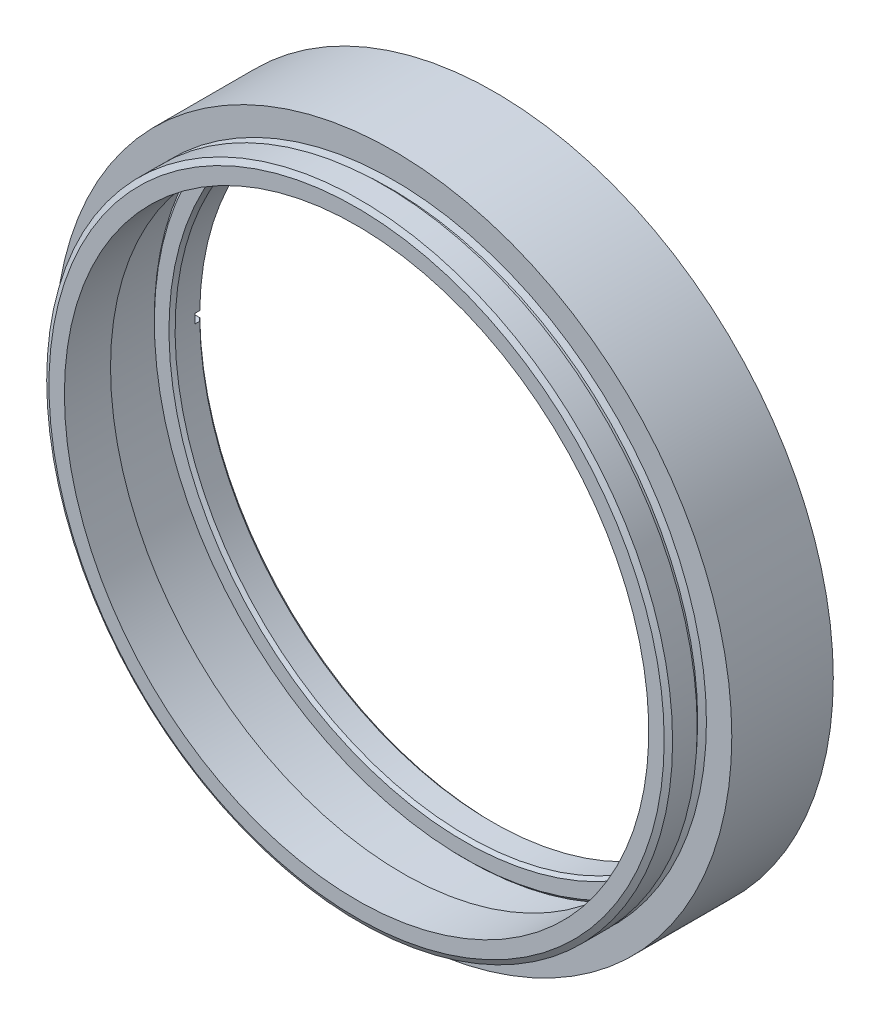
ISO-10303-21;
HEADER;
FILE_DESCRIPTION(('STEP AP214'),'2;1');
FILE_NAME('part.step','',(''),(''),'','','');
FILE_SCHEMA(('AUTOMOTIVE_DESIGN { 1 0 10303 214 1 1 1 1 }'));
ENDSEC;
DATA;
#1=APPLICATION_CONTEXT('core data for automotive mechanical design processes');
#2=APPLICATION_PROTOCOL_DEFINITION('international standard','automotive_design',2000,#1);
#3=PRODUCT_CONTEXT('',#1,'mechanical');
#4=PRODUCT('Part','Part','',(#3));
#5=PRODUCT_RELATED_PRODUCT_CATEGORY('part','',(#4));
#6=PRODUCT_DEFINITION_FORMATION('','',#4);
#7=PRODUCT_DEFINITION_CONTEXT('part definition',#1,'design');
#8=PRODUCT_DEFINITION('design','',#6,#7);
#9=PRODUCT_DEFINITION_SHAPE('','',#8);
#10=(LENGTH_UNIT() NAMED_UNIT(*) SI_UNIT(.MILLI.,.METRE.));
#11=(NAMED_UNIT(*) PLANE_ANGLE_UNIT() SI_UNIT($,.RADIAN.));
#12=(NAMED_UNIT(*) SI_UNIT($,.STERADIAN.) SOLID_ANGLE_UNIT());
#13=UNCERTAINTY_MEASURE_WITH_UNIT(LENGTH_MEASURE(1.E-05),#10,'distance_accuracy_value','');
#14=(GEOMETRIC_REPRESENTATION_CONTEXT(3) GLOBAL_UNCERTAINTY_ASSIGNED_CONTEXT((#13)) GLOBAL_UNIT_ASSIGNED_CONTEXT((#10,
#11,#12)) REPRESENTATION_CONTEXT('',''));
#15=CARTESIAN_POINT('',(0.,0.,0.));
#16=DIRECTION('',(0.,0.,1.));
#17=DIRECTION('',(1.,0.,0.));
#18=AXIS2_PLACEMENT_3D('',#15,#16,#17);
#19=CARTESIAN_POINT('',(0.,0.,5.715));
#20=DIRECTION('',(0.,0.,-1.));
#21=DIRECTION('',(-1.,0.,0.));
#22=AXIS2_PLACEMENT_3D('',#19,#20,#21);
#23=CYLINDRICAL_SURFACE('',#22,24.13);
#24=CARTESIAN_POINT('',(0.,0.,5.715));
#25=DIRECTION('',(0.,0.,-1.));
#26=DIRECTION('',(-1.,0.,0.));
#27=AXIS2_PLACEMENT_3D('',#24,#25,#26);
#28=CIRCLE('',#27,24.13);
#29=CARTESIAN_POINT('',(-24.13,0.,5.715));
#30=VERTEX_POINT('',#29);
#31=EDGE_CURVE('P0_E37',#30,#30,#28,.T.);
#32=ORIENTED_EDGE('',*,*,#31,.F.);
#33=EDGE_LOOP('',(#32));
#34=FACE_BOUND('',#33,.T.);
#35=CARTESIAN_POINT('',(0.,0.,1.905));
#36=DIRECTION('',(0.,0.,-1.));
#37=DIRECTION('',(-1.,0.,0.));
#38=AXIS2_PLACEMENT_3D('',#35,#36,#37);
#39=CIRCLE('',#38,24.13);
#40=CARTESIAN_POINT('',(-24.13,0.,1.905));
#41=VERTEX_POINT('',#40);
#42=EDGE_CURVE('P0_E34',#41,#41,#39,.F.);
#43=ORIENTED_EDGE('',*,*,#42,.F.);
#44=EDGE_LOOP('',(#43));
#45=FACE_BOUND('',#44,.T.);
#46=ADVANCED_FACE('P0_F13',(#34,#45),#23,.F.);
#47=CARTESIAN_POINT('',(0.,0.,-5.715));
#48=DIRECTION('',(0.,0.,-1.));
#49=DIRECTION('',(-1.,0.,0.));
#50=AXIS2_PLACEMENT_3D('',#47,#48,#49);
#51=PLANE('',#50);
#52=CARTESIAN_POINT('',(0.,0.,-5.715));
#53=DIRECTION('',(0.,0.,-1.));
#54=DIRECTION('',(-1.,0.,0.));
#55=AXIS2_PLACEMENT_3D('',#52,#53,#54);
#56=CIRCLE('',#55,26.0985000000001);
#57=CARTESIAN_POINT('',(-26.0985000000001,0.,-5.715));
#58=VERTEX_POINT('',#57);
#59=EDGE_CURVE('P0_E9',#58,#58,#56,.F.);
#60=ORIENTED_EDGE('',*,*,#59,.T.);
#61=EDGE_LOOP('',(#60));
#62=FACE_BOUND('',#61,.T.);
#63=CARTESIAN_POINT('',(0.,0.,-5.71500000000001));
#64=DIRECTION('',(0.,0.,1.));
#65=DIRECTION('',(1.,0.,0.));
#66=AXIS2_PLACEMENT_3D('',#63,#64,#65);
#67=CIRCLE('',#66,27.94);
#68=CARTESIAN_POINT('',(27.94,0.,-5.71500000000001));
#69=VERTEX_POINT('',#68);
#70=EDGE_CURVE('P0_E52',#69,#69,#67,.T.);
#71=ORIENTED_EDGE('',*,*,#70,.F.);
#72=EDGE_LOOP('',(#71));
#73=FACE_BOUND('',#72,.T.);
#74=ADVANCED_FACE('P0_F86',(#62,#73),#51,.T.);
#75=CARTESIAN_POINT('',(0.,0.,5.715));
#76=DIRECTION('',(0.,0.,1.));
#77=DIRECTION('',(1.,0.,0.));
#78=AXIS2_PLACEMENT_3D('',#75,#76,#77);
#79=PLANE('',#78);
#80=CARTESIAN_POINT('',(0.,0.,5.715));
#81=DIRECTION('',(0.,0.,1.));
#82=DIRECTION('',(1.,0.,0.));
#83=AXIS2_PLACEMENT_3D('',#80,#81,#82);
#84=CIRCLE('',#83,25.4045590948775);
#85=CARTESIAN_POINT('',(25.4045590948775,0.,5.715));
#86=VERTEX_POINT('',#85);
#87=EDGE_CURVE('P0_E30',#86,#86,#84,.T.);
#88=ORIENTED_EDGE('',*,*,#87,.T.);
#89=EDGE_LOOP('',(#88));
#90=FACE_BOUND('',#89,.T.);
#91=ORIENTED_EDGE('',*,*,#31,.T.);
#92=EDGE_LOOP('',(#91));
#93=FACE_BOUND('',#92,.T.);
#94=ADVANCED_FACE('P0_F92',(#90,#93),#79,.T.);
#95=CARTESIAN_POINT('',(0.,0.,17.8527412539212));
#96=DIRECTION('',(0.,0.,1.));
#97=DIRECTION('',(1.,0.,0.));
#98=AXIS2_PLACEMENT_3D('',#95,#96,#97);
#99=CYLINDRICAL_SURFACE('',#98,25.8445);
#100=CARTESIAN_POINT('',(0.,0.,5.46100000000001));
#101=DIRECTION('',(0.,0.,1.));
#102=DIRECTION('',(1.,0.,0.));
#103=AXIS2_PLACEMENT_3D('',#100,#101,#102);
#104=CIRCLE('',#103,25.8445);
#105=CARTESIAN_POINT('',(25.8445,0.,5.46100000000001));
#106=VERTEX_POINT('',#105);
#107=EDGE_CURVE('P0_E25',#106,#106,#104,.F.);
#108=ORIENTED_EDGE('',*,*,#107,.T.);
#109=EDGE_LOOP('',(#108));
#110=FACE_BOUND('',#109,.T.);
#111=CARTESIAN_POINT('',(0.,0.,3.42899999999998));
#112=DIRECTION('',(0.,0.,1.));
#113=DIRECTION('',(1.,0.,0.));
#114=AXIS2_PLACEMENT_3D('',#111,#112,#113);
#115=CIRCLE('',#114,25.8445);
#116=CARTESIAN_POINT('',(25.8445,0.,3.42899999999998));
#117=VERTEX_POINT('',#116);
#118=EDGE_CURVE('P0_E33',#117,#117,#115,.T.);
#119=ORIENTED_EDGE('',*,*,#118,.T.);
#120=EDGE_LOOP('',(#119));
#121=FACE_BOUND('',#120,.T.);
#122=ADVANCED_FACE('P0_F119',(#110,#121),#99,.T.);
#123=CARTESIAN_POINT('',(0.,0.,3.42899999999998));
#124=DIRECTION('',(0.,0.,1.));
#125=DIRECTION('',(1.,0.,0.));
#126=AXIS2_PLACEMENT_3D('',#123,#124,#125);
#127=CONICAL_SURFACE('',#126,25.8445,1.04719755119667);
#128=CARTESIAN_POINT('',(0.,0.,3.16503545692652));
#129=DIRECTION('',(0.,0.,1.));
#130=DIRECTION('',(1.,0.,0.));
#131=AXIS2_PLACEMENT_3D('',#128,#129,#130);
#132=CIRCLE('',#131,25.3873);
#133=CARTESIAN_POINT('',(25.3873,0.,3.16503545692652));
#134=VERTEX_POINT('',#133);
#135=EDGE_CURVE('P0_E40',#134,#134,#132,.T.);
#136=ORIENTED_EDGE('',*,*,#135,.T.);
#137=EDGE_LOOP('',(#136));
#138=FACE_BOUND('',#137,.T.);
#139=ORIENTED_EDGE('',*,*,#118,.F.);
#140=EDGE_LOOP('',(#139));
#141=FACE_BOUND('',#140,.T.);
#142=ADVANCED_FACE('P0_F115',(#138,#141),#127,.T.);
#143=CARTESIAN_POINT('',(0.,0.,17.8527412539212));
#144=DIRECTION('',(0.,0.,1.));
#145=DIRECTION('',(1.,0.,0.));
#146=AXIS2_PLACEMENT_3D('',#143,#144,#145);
#147=CYLINDRICAL_SURFACE('',#146,25.3873);
#148=CARTESIAN_POINT('',(0.,0.,2.9309645430735));
#149=DIRECTION('',(0.,0.,1.));
#150=DIRECTION('',(1.,0.,0.));
#151=AXIS2_PLACEMENT_3D('',#148,#149,#150);
#152=CIRCLE('',#151,25.3873);
#153=CARTESIAN_POINT('',(25.3873,0.,2.9309645430735));
#154=VERTEX_POINT('',#153);
#155=EDGE_CURVE('P0_E43',#154,#154,#152,.T.);
#156=ORIENTED_EDGE('',*,*,#155,.T.);
#157=EDGE_LOOP('',(#156));
#158=FACE_BOUND('',#157,.T.);
#159=ORIENTED_EDGE('',*,*,#135,.F.);
#160=EDGE_LOOP('',(#159));
#161=FACE_BOUND('',#160,.T.);
#162=ADVANCED_FACE('P0_F111',(#158,#161),#147,.T.);
#163=CARTESIAN_POINT('',(0.,0.,2.9309645430735));
#164=DIRECTION('',(0.,0.,-1.));
#165=DIRECTION('',(-1.,0.,0.));
#166=AXIS2_PLACEMENT_3D('',#163,#164,#165);
#167=CONICAL_SURFACE('',#166,25.3873,1.0471975511966);
#168=CARTESIAN_POINT('',(0.,0.,2.667));
#169=DIRECTION('',(0.,0.,1.));
#170=DIRECTION('',(1.,0.,0.));
#171=AXIS2_PLACEMENT_3D('',#168,#169,#170);
#172=CIRCLE('',#171,25.8445);
#173=CARTESIAN_POINT('',(25.8445,0.,2.667));
#174=VERTEX_POINT('',#173);
#175=EDGE_CURVE('P0_E46',#174,#174,#172,.T.);
#176=ORIENTED_EDGE('',*,*,#175,.T.);
#177=EDGE_LOOP('',(#176));
#178=FACE_BOUND('',#177,.T.);
#179=ORIENTED_EDGE('',*,*,#155,.F.);
#180=EDGE_LOOP('',(#179));
#181=FACE_BOUND('',#180,.T.);
#182=ADVANCED_FACE('P0_F107',(#178,#181),#167,.T.);
#183=CARTESIAN_POINT('',(0.,-25.8445,2.667));
#184=DIRECTION('',(0.,0.,1.));
#185=DIRECTION('',(1.,0.,0.));
#186=AXIS2_PLACEMENT_3D('',#183,#184,#185);
#187=PLANE('',#186);
#188=CARTESIAN_POINT('',(0.,0.,2.66699999999999));
#189=DIRECTION('',(0.,0.,1.));
#190=DIRECTION('',(1.,0.,0.));
#191=AXIS2_PLACEMENT_3D('',#188,#189,#190);
#192=CIRCLE('',#191,27.94);
#193=CARTESIAN_POINT('',(27.94,0.,2.66699999999999));
#194=VERTEX_POINT('',#193);
#195=EDGE_CURVE('P0_E49',#194,#194,#192,.T.);
#196=ORIENTED_EDGE('',*,*,#195,.T.);
#197=EDGE_LOOP('',(#196));
#198=FACE_BOUND('',#197,.T.);
#199=ORIENTED_EDGE('',*,*,#175,.F.);
#200=EDGE_LOOP('',(#199));
#201=FACE_BOUND('',#200,.T.);
#202=ADVANCED_FACE('P0_F103',(#198,#201),#187,.T.);
#203=CARTESIAN_POINT('',(0.,0.,17.8527412539212));
#204=DIRECTION('',(0.,0.,1.));
#205=DIRECTION('',(1.,0.,0.));
#206=AXIS2_PLACEMENT_3D('',#203,#204,#205);
#207=CYLINDRICAL_SURFACE('',#206,27.94);
#208=ORIENTED_EDGE('',*,*,#70,.T.);
#209=EDGE_LOOP('',(#208));
#210=FACE_BOUND('',#209,.T.);
#211=ORIENTED_EDGE('',*,*,#195,.F.);
#212=EDGE_LOOP('',(#211));
#213=FACE_BOUND('',#212,.T.);
#214=ADVANCED_FACE('P0_F99',(#210,#213),#207,.T.);
#215=CARTESIAN_POINT('',(0.,0.,1.905));
#216=DIRECTION('',(0.,0.,-1.));
#217=DIRECTION('',(-1.,0.,0.));
#218=AXIS2_PLACEMENT_3D('',#215,#216,#217);
#219=PLANE('',#218);
#220=ORIENTED_EDGE('',*,*,#42,.T.);
#221=EDGE_LOOP('',(#220));
#222=FACE_BOUND('',#221,.T.);
#223=CARTESIAN_POINT('',(0.,0.,1.905));
#224=DIRECTION('',(0.,0.,-1.));
#225=DIRECTION('',(-1.,0.,0.));
#226=AXIS2_PLACEMENT_3D('',#223,#224,#225);
#227=CIRCLE('',#226,26.0985);
#228=CARTESIAN_POINT('',(-26.0985,0.,1.905));
#229=VERTEX_POINT('',#228);
#230=EDGE_CURVE('P0_E60',#229,#229,#227,.T.);
#231=ORIENTED_EDGE('',*,*,#230,.T.);
#232=EDGE_LOOP('',(#231));
#233=FACE_BOUND('',#232,.T.);
#234=ADVANCED_FACE('P0_F102',(#222,#233),#219,.T.);
#235=CARTESIAN_POINT('',(0.,0.,1.905));
#236=DIRECTION('',(0.,0.,-1.));
#237=DIRECTION('',(-1.,0.,0.));
#238=AXIS2_PLACEMENT_3D('',#235,#236,#237);
#239=CYLINDRICAL_SURFACE('',#238,25.8445);
#240=CARTESIAN_POINT('',(0.,0.,1.397));
#241=DIRECTION('',(0.,0.,-1.));
#242=DIRECTION('',(-1.,0.,0.));
#243=AXIS2_PLACEMENT_3D('',#240,#241,#242);
#244=CIRCLE('',#243,25.8445);
#245=CARTESIAN_POINT('',(-25.8445,0.,1.397));
#246=VERTEX_POINT('',#245);
#247=EDGE_CURVE('P0_E17',#246,#246,#244,.F.);
#248=CARTESIAN_POINT('',(0.,0.,-5.27505909487741));
#249=DIRECTION('',(0.,0.,-1.));
#250=DIRECTION('',(-1.,0.,0.));
#251=AXIS2_PLACEMENT_3D('',#248,#249,#250);
#252=CIRCLE('',#251,25.8445);
#253=CARTESIAN_POINT('',(-25.8445,0.,-5.27505909487741));
#254=VERTEX_POINT('',#253);
#255=EDGE_CURVE('P0_E21',#254,#254,#252,.T.);
#256=CARTESIAN_POINT('',(-25.8445,0.,1.397));
#257=CARTESIAN_POINT('',(-25.8445,0.,1.32749938442836));
#258=CARTESIAN_POINT('',(-25.8445,0.,1.25799876885672));
#259=CARTESIAN_POINT('',(-25.8445,0.,1.11899753771344));
#260=CARTESIAN_POINT('',(-25.8445,0.,1.0494969221418));
#261=CARTESIAN_POINT('',(-25.8445,0.,0.910495690998522));
#262=CARTESIAN_POINT('',(-25.8445,0.,0.840995075426882));
#263=CARTESIAN_POINT('',(-25.8445,0.,0.701993844283603));
#264=CARTESIAN_POINT('',(-25.8445,0.,0.632493228711963));
#265=CARTESIAN_POINT('',(-25.8445,0.,0.493491997568684));
#266=CARTESIAN_POINT('',(-25.8445,0.,0.423991381997044));
#267=CARTESIAN_POINT('',(-25.8445,0.,0.284990150853765));
#268=CARTESIAN_POINT('',(-25.8445,0.,0.215489535282125));
#269=CARTESIAN_POINT('',(-25.8445,0.,0.0764883041388458));
#270=CARTESIAN_POINT('',(-25.8445,0.,0.00698768856720612));
#271=CARTESIAN_POINT('',(-25.8445,0.,-0.132013542576073));
#272=CARTESIAN_POINT('',(-25.8445,0.,-0.201514158147713));
#273=CARTESIAN_POINT('',(-25.8445,0.,-0.340515389290992));
#274=CARTESIAN_POINT('',(-25.8445,0.,-0.410016004862632));
#275=CARTESIAN_POINT('',(-25.8445,0.,-0.549017236005911));
#276=CARTESIAN_POINT('',(-25.8445,0.,-0.618517851577551));
#277=CARTESIAN_POINT('',(-25.8445,0.,-0.75751908272083));
#278=CARTESIAN_POINT('',(-25.8445,0.,-0.82701969829247));
#279=CARTESIAN_POINT('',(-25.8445,0.,-0.966020929435749));
#280=CARTESIAN_POINT('',(-25.8445,0.,-1.03552154500739));
#281=CARTESIAN_POINT('',(-25.8445,0.,-1.17452277615067));
#282=CARTESIAN_POINT('',(-25.8445,0.,-1.24402339172231));
#283=CARTESIAN_POINT('',(-25.8445,0.,-1.38302462286559));
#284=CARTESIAN_POINT('',(-25.8445,0.,-1.45252523843723));
#285=CARTESIAN_POINT('',(-25.8445,0.,-1.59152646958051));
#286=CARTESIAN_POINT('',(-25.8445,0.,-1.66102708515215));
#287=CARTESIAN_POINT('',(-25.8445,0.,-1.80002831629542));
#288=CARTESIAN_POINT('',(-25.8445,0.,-1.86952893186706));
#289=CARTESIAN_POINT('',(-25.8445,0.,-2.00853016301034));
#290=CARTESIAN_POINT('',(-25.8445,0.,-2.07803077858198));
#291=CARTESIAN_POINT('',(-25.8445,0.,-2.21703200972526));
#292=CARTESIAN_POINT('',(-25.8445,0.,-2.2865326252969));
#293=CARTESIAN_POINT('',(-25.8445,0.,-2.42553385644018));
#294=CARTESIAN_POINT('',(-25.8445,0.,-2.49503447201182));
#295=CARTESIAN_POINT('',(-25.8445,0.,-2.6340357031551));
#296=CARTESIAN_POINT('',(-25.8445,0.,-2.70353631872674));
#297=CARTESIAN_POINT('',(-25.8445,0.,-2.84253754987002));
#298=CARTESIAN_POINT('',(-25.8445,0.,-2.91203816544166));
#299=CARTESIAN_POINT('',(-25.8445,0.,-3.05103939658494));
#300=CARTESIAN_POINT('',(-25.8445,0.,-3.12054001215658));
#301=CARTESIAN_POINT('',(-25.8445,0.,-3.25954124329986));
#302=CARTESIAN_POINT('',(-25.8445,0.,-3.3290418588715));
#303=CARTESIAN_POINT('',(-25.8445,0.,-3.46804309001478));
#304=CARTESIAN_POINT('',(-25.8445,0.,-3.53754370558642));
#305=CARTESIAN_POINT('',(-25.8445,0.,-3.67654493672969));
#306=CARTESIAN_POINT('',(-25.8445,0.,-3.74604555230133));
#307=CARTESIAN_POINT('',(-25.8445,0.,-3.88504678344461));
#308=CARTESIAN_POINT('',(-25.8445,0.,-3.95454739901625));
#309=CARTESIAN_POINT('',(-25.8445,0.,-4.09354863015953));
#310=CARTESIAN_POINT('',(-25.8445,0.,-4.16304924573117));
#311=CARTESIAN_POINT('',(-25.8445,0.,-4.30205047687445));
#312=CARTESIAN_POINT('',(-25.8445,0.,-4.37155109244609));
#313=CARTESIAN_POINT('',(-25.8445,0.,-4.51055232358937));
#314=CARTESIAN_POINT('',(-25.8445,0.,-4.58005293916101));
#315=CARTESIAN_POINT('',(-25.8445,0.,-4.71905417030429));
#316=CARTESIAN_POINT('',(-25.8445,0.,-4.78855478587593));
#317=CARTESIAN_POINT('',(-25.8445,0.,-4.92755601701921));
#318=CARTESIAN_POINT('',(-25.8445,0.,-4.99705663259085));
#319=CARTESIAN_POINT('',(-25.8445,0.,-5.13605786373413));
#320=CARTESIAN_POINT('',(-25.8445,0.,-5.20555847930577));
#321=CARTESIAN_POINT('',(-25.8445,0.,-5.27505909487741));
#322=B_SPLINE_CURVE_WITH_KNOTS('',3,(#256,#257,#258,#259,#260,#261,#262,#263,#264,#265,#266,
#267,#268,#269,#270,#271,#272,#273,#274,#275,#276,#277,#278,#279,#280,#281,#282,#283,#284,#285,
#286,#287,#288,#289,#290,#291,#292,#293,#294,#295,#296,#297,#298,#299,#300,#301,#302,#303,#304,
#305,#306,#307,#308,#309,#310,#311,#312,#313,#314,#315,#316,#317,#318,#319,#320,#321),
.UNSPECIFIED.,.F.,.F.,(4,2,2,2,2,2,2,2,2,2,2,2,2,2,2,2,2,2,2,2,2,2,2,2,2,2,2,2,2,2,2,2,4),(0.,
0.208501846714919,0.417003693429838,0.625505540144757,0.834007386859675,1.04250923357459,
1.25101108028951,1.45951292700443,1.66801477371935,1.87651662043427,2.08501846714919,
2.29352031386411,2.50202216057903,2.71052400729395,2.91902585400886,3.12752770072378,
3.3360295474387,3.54453139415362,3.75303324086854,3.96153508758346,4.17003693429838,
4.3785387810133,4.58704062772822,4.79554247444313,5.00404432115805,5.21254616787297,
5.42104801458789,5.62954986130281,5.83805170801773,6.04655355473265,6.25505540144757,
6.46355724816249,6.67205909487741),.UNSPECIFIED.);
#323=EDGE_CURVE('P0_BSEAM67',#246,#254,#322,.T.);
#324=ORIENTED_EDGE('',*,*,#247,.T.);
#325=ORIENTED_EDGE('',*,*,#255,.T.);
#326=ORIENTED_EDGE('',*,*,#323,.T.);
#327=ORIENTED_EDGE('',*,*,#323,.F.);
#328=EDGE_LOOP('',(#324,#326,#325,#327));
#329=FACE_BOUND('',#328,.T.);
#330=ADVANCED_FACE('P0_F67',(#329),#239,.F.);
#331=CARTESIAN_POINT('',(0.,0.,5.715));
#332=DIRECTION('',(0.,0.,-1.));
#333=DIRECTION('',(-1.,0.,0.));
#334=AXIS2_PLACEMENT_3D('',#331,#332,#333);
#335=CONICAL_SURFACE('',#334,25.4045590948775,1.0471975511966);
#336=ORIENTED_EDGE('',*,*,#107,.F.);
#337=EDGE_LOOP('',(#336));
#338=FACE_BOUND('',#337,.T.);
#339=ORIENTED_EDGE('',*,*,#87,.F.);
#340=EDGE_LOOP('',(#339));
#341=FACE_BOUND('',#340,.T.);
#342=ADVANCED_FACE('P0_F82',(#338,#341),#335,.T.);
#343=CARTESIAN_POINT('',(0.,0.,-5.27505909487741));
#344=DIRECTION('',(0.,0.,-1.));
#345=DIRECTION('',(-1.,0.,0.));
#346=AXIS2_PLACEMENT_3D('',#343,#344,#345);
#347=CONICAL_SURFACE('',#346,25.8445,0.523598775598314);
#348=ORIENTED_EDGE('',*,*,#59,.F.);
#349=EDGE_LOOP('',(#348));
#350=FACE_BOUND('',#349,.T.);
#351=ORIENTED_EDGE('',*,*,#255,.F.);
#352=EDGE_LOOP('',(#351));
#353=FACE_BOUND('',#352,.T.);
#354=ADVANCED_FACE('P0_F15',(#350,#353),#347,.F.);
#355=CARTESIAN_POINT('',(0.,0.,1.397));
#356=DIRECTION('',(0.,0.,-1.));
#357=DIRECTION('',(-1.,0.,0.));
#358=AXIS2_PLACEMENT_3D('',#355,#356,#357);
#359=PLANE('',#358);
#360=CARTESIAN_POINT('',(0.,0.,1.397));
#361=DIRECTION('',(0.,0.,-1.));
#362=DIRECTION('',(-1.,0.,0.));
#363=AXIS2_PLACEMENT_3D('',#360,#361,#362);
#364=CIRCLE('',#363,26.0985);
#365=CARTESIAN_POINT('',(-26.0985,0.,1.397));
#366=VERTEX_POINT('',#365);
#367=EDGE_CURVE('P0_E57',#366,#366,#364,.T.);
#368=ORIENTED_EDGE('',*,*,#367,.F.);
#369=EDGE_LOOP('',(#368));
#370=FACE_BOUND('',#369,.T.);
#371=ORIENTED_EDGE('',*,*,#247,.F.);
#372=EDGE_LOOP('',(#371));
#373=FACE_BOUND('',#372,.T.);
#374=ADVANCED_FACE('P0_F70',(#370,#373),#359,.F.);
#375=CARTESIAN_POINT('',(0.,0.,1.905));
#376=DIRECTION('',(0.,0.,-1.));
#377=DIRECTION('',(-1.,0.,0.));
#378=AXIS2_PLACEMENT_3D('',#375,#376,#377);
#379=CYLINDRICAL_SURFACE('',#378,26.0985);
#380=ORIENTED_EDGE('',*,*,#230,.F.);
#381=EDGE_LOOP('',(#380));
#382=FACE_BOUND('',#381,.T.);
#383=ORIENTED_EDGE('',*,*,#367,.T.);
#384=EDGE_LOOP('',(#383));
#385=FACE_BOUND('',#384,.T.);
#386=ADVANCED_FACE('P0_F72',(#382,#385),#379,.F.);
#387=CLOSED_SHELL('',(#46,#74,#94,#122,#142,#162,#182,#202,#214,#234,#330,#342,#354,#374,#386));
#388=MANIFOLD_SOLID_BREP('P0_B1',#387);
#389=CARTESIAN_POINT('',(0.,0.,-5.715));
#390=DIRECTION('',(0.,0.,-1.));
#391=DIRECTION('',(0.,1.,0.));
#392=AXIS2_PLACEMENT_3D('',#389,#390,#391);
#393=PLANE('',#392);
#394=DIRECTION('',(-1.,0.,0.));
#395=VECTOR('',#394,1.);
#396=CARTESIAN_POINT('',(28.73123812311,-0.380999999999999,-5.715));
#397=LINE('',#396,#395);
#398=CARTESIAN_POINT('',(-24.3810232558029,-0.381000000000001,-5.715));
#399=VERTEX_POINT('',#398);
#400=CARTESIAN_POINT('',(-25.5876636145233,-0.381000000000001,-5.715));
#401=VERTEX_POINT('',#400);
#402=EDGE_CURVE('P1_E262',#399,#401,#397,.T.);
#403=ORIENTED_EDGE('',*,*,#402,.F.);
#404=CARTESIAN_POINT('',(0.,0.,-5.715));
#405=DIRECTION('',(0.,0.,-1.));
#406=DIRECTION('',(0.,1.,0.));
#407=AXIS2_PLACEMENT_3D('',#404,#405,#406);
#408=CIRCLE('',#407,24.384);
#409=CARTESIAN_POINT('',(24.3810232558029,-0.380999999999999,-5.715));
#410=VERTEX_POINT('',#409);
#411=EDGE_CURVE('P1_E219',#399,#410,#408,.F.);
#412=ORIENTED_EDGE('',*,*,#411,.T.);
#413=CARTESIAN_POINT('',(25.5876636145233,-0.380999999999999,-5.715));
#414=VERTEX_POINT('',#413);
#415=EDGE_CURVE('P1_E261',#414,#410,#397,.T.);
#416=ORIENTED_EDGE('',*,*,#415,.F.);
#417=CARTESIAN_POINT('',(0.,0.,-5.715));
#418=DIRECTION('',(0.,0.,-1.));
#419=DIRECTION('',(0.,1.,0.));
#420=AXIS2_PLACEMENT_3D('',#417,#418,#419);
#421=CIRCLE('',#420,25.5905);
#422=EDGE_CURVE('P1_E272',#414,#401,#421,.T.);
#423=ORIENTED_EDGE('',*,*,#422,.T.);
#424=EDGE_LOOP('',(#403,#412,#416,#423));
#425=FACE_BOUND('',#424,.T.);
#426=ADVANCED_FACE('P1_F15',(#425),#393,.T.);
#427=DIRECTION('',(1.,0.,0.));
#428=VECTOR('',#427,1.);
#429=CARTESIAN_POINT('',(28.73123812311,0.381000000000001,-5.715));
#430=LINE('',#429,#428);
#431=CARTESIAN_POINT('',(24.3810232558029,0.381000000000001,-5.715));
#432=VERTEX_POINT('',#431);
#433=CARTESIAN_POINT('',(25.5876636145233,0.381000000000001,-5.715));
#434=VERTEX_POINT('',#433);
#435=EDGE_CURVE('P1_E258',#432,#434,#430,.T.);
#436=ORIENTED_EDGE('',*,*,#435,.F.);
#437=CARTESIAN_POINT('',(0.,0.,-5.715));
#438=DIRECTION('',(0.,0.,-1.));
#439=DIRECTION('',(0.,1.,0.));
#440=AXIS2_PLACEMENT_3D('',#437,#438,#439);
#441=CIRCLE('',#440,24.384);
#442=CARTESIAN_POINT('',(-24.3810232558029,0.381,-5.715));
#443=VERTEX_POINT('',#442);
#444=EDGE_CURVE('P1_E36',#432,#443,#441,.F.);
#445=ORIENTED_EDGE('',*,*,#444,.T.);
#446=CARTESIAN_POINT('',(-25.5876636145233,0.381,-5.715));
#447=VERTEX_POINT('',#446);
#448=EDGE_CURVE('P1_E144',#447,#443,#430,.T.);
#449=ORIENTED_EDGE('',*,*,#448,.F.);
#450=CARTESIAN_POINT('',(0.,0.,-5.715));
#451=DIRECTION('',(0.,0.,-1.));
#452=DIRECTION('',(0.,1.,0.));
#453=AXIS2_PLACEMENT_3D('',#450,#451,#452);
#454=CIRCLE('',#453,25.5905);
#455=EDGE_CURVE('P1_E249',#447,#434,#454,.T.);
#456=ORIENTED_EDGE('',*,*,#455,.T.);
#457=EDGE_LOOP('',(#436,#445,#449,#456));
#458=FACE_BOUND('',#457,.T.);
#459=ADVANCED_FACE('P1_F257',(#458),#393,.T.);
#460=CARTESIAN_POINT('',(0.,0.,-3.175));
#461=DIRECTION('',(0.,0.,-1.));
#462=DIRECTION('',(0.,1.,0.));
#463=AXIS2_PLACEMENT_3D('',#460,#461,#462);
#464=PLANE('',#463);
#465=CARTESIAN_POINT('',(0.,0.,-3.175));
#466=DIRECTION('',(0.,0.,-1.));
#467=DIRECTION('',(0.,1.,0.));
#468=AXIS2_PLACEMENT_3D('',#465,#466,#467);
#469=CIRCLE('',#468,24.384);
#470=CARTESIAN_POINT('',(0.,24.384,-3.175));
#471=VERTEX_POINT('',#470);
#472=EDGE_CURVE('P1_E168',#471,#471,#469,.T.);
#473=ORIENTED_EDGE('',*,*,#472,.T.);
#474=EDGE_LOOP('',(#473));
#475=FACE_BOUND('',#474,.T.);
#476=CARTESIAN_POINT('',(0.,0.,-3.175));
#477=DIRECTION('',(0.,0.,-1.));
#478=DIRECTION('',(0.,1.,0.));
#479=AXIS2_PLACEMENT_3D('',#476,#477,#478);
#480=CIRCLE('',#479,25.5905);
#481=CARTESIAN_POINT('',(0.,25.5905,-3.175));
#482=VERTEX_POINT('',#481);
#483=EDGE_CURVE('P1_E165',#482,#482,#480,.F.);
#484=ORIENTED_EDGE('',*,*,#483,.T.);
#485=EDGE_LOOP('',(#484));
#486=FACE_BOUND('',#485,.T.);
#487=ADVANCED_FACE('P1_F289',(#475,#486),#464,.F.);
#488=CARTESIAN_POINT('',(0.,0.,-5.715));
#489=DIRECTION('',(0.,0.,1.));
#490=DIRECTION('',(0.,-1.,0.));
#491=AXIS2_PLACEMENT_3D('',#488,#489,#490);
#492=CYLINDRICAL_SURFACE('',#491,25.8445);
#493=CARTESIAN_POINT('',(0.,0.,-3.42900000000001));
#494=DIRECTION('',(0.,0.,-1.));
#495=DIRECTION('',(0.,1.,0.));
#496=AXIS2_PLACEMENT_3D('',#493,#494,#495);
#497=CIRCLE('',#496,25.8445);
#498=CARTESIAN_POINT('',(0.,25.8445,-3.42900000000001));
#499=VERTEX_POINT('',#498);
#500=EDGE_CURVE('P1_E183',#499,#499,#497,.T.);
#501=ORIENTED_EDGE('',*,*,#500,.T.);
#502=EDGE_LOOP('',(#501));
#503=FACE_BOUND('',#502,.T.);
#504=DIRECTION('',(0.,0.,1.));
#505=VECTOR('',#504,1.);
#506=CARTESIAN_POINT('',(25.8416914935923,0.381000000000001,-5.715));
#507=LINE('',#506,#505);
#508=CARTESIAN_POINT('',(25.8416914935923,0.381000000000001,-5.08));
#509=VERTEX_POINT('',#508);
#510=CARTESIAN_POINT('',(25.8416914935923,0.381000000000001,-5.46100000000001));
#511=VERTEX_POINT('',#510);
#512=EDGE_CURVE('P1_E132',#509,#511,#507,.F.);
#513=ORIENTED_EDGE('',*,*,#512,.T.);
#514=CARTESIAN_POINT('',(0.,0.,-5.46100000000001));
#515=DIRECTION('',(0.,0.,-1.));
#516=DIRECTION('',(0.,1.,0.));
#517=AXIS2_PLACEMENT_3D('',#514,#515,#516);
#518=CIRCLE('',#517,25.8445);
#519=CARTESIAN_POINT('',(-25.8416914935923,0.381,-5.46100000000001));
#520=VERTEX_POINT('',#519);
#521=EDGE_CURVE('P1_E181',#511,#520,#518,.F.);
#522=ORIENTED_EDGE('',*,*,#521,.T.);
#523=DIRECTION('',(0.,0.,1.));
#524=VECTOR('',#523,1.);
#525=CARTESIAN_POINT('',(-25.8416914935923,0.381,-5.715));
#526=LINE('',#525,#524);
#527=CARTESIAN_POINT('',(-25.8416914935923,0.381,-5.08));
#528=VERTEX_POINT('',#527);
#529=EDGE_CURVE('P1_E150',#520,#528,#526,.T.);
#530=ORIENTED_EDGE('',*,*,#529,.T.);
#531=CARTESIAN_POINT('',(0.,0.,-5.08));
#532=DIRECTION('',(0.,0.,-1.));
#533=DIRECTION('',(0.,1.,0.));
#534=AXIS2_PLACEMENT_3D('',#531,#532,#533);
#535=CIRCLE('',#534,25.8445);
#536=CARTESIAN_POINT('',(-25.8416914935923,-0.381000000000001,-5.08));
#537=VERTEX_POINT('',#536);
#538=EDGE_CURVE('P1_E133',#537,#528,#535,.T.);
#539=ORIENTED_EDGE('',*,*,#538,.F.);
#540=DIRECTION('',(0.,0.,1.));
#541=VECTOR('',#540,1.);
#542=CARTESIAN_POINT('',(-25.8416914935923,-0.381000000000001,-5.715));
#543=LINE('',#542,#541);
#544=CARTESIAN_POINT('',(-25.8416914935923,-0.381000000000001,-5.46100000000001));
#545=VERTEX_POINT('',#544);
#546=EDGE_CURVE('P1_E122',#537,#545,#543,.F.);
#547=ORIENTED_EDGE('',*,*,#546,.T.);
#548=CARTESIAN_POINT('',(0.,0.,-5.46100000000001));
#549=DIRECTION('',(0.,0.,-1.));
#550=DIRECTION('',(0.,1.,0.));
#551=AXIS2_PLACEMENT_3D('',#548,#549,#550);
#552=CIRCLE('',#551,25.8445);
#553=CARTESIAN_POINT('',(25.8416914935923,-0.380999999999999,-5.46100000000001));
#554=VERTEX_POINT('',#553);
#555=EDGE_CURVE('P1_E117',#545,#554,#552,.F.);
#556=ORIENTED_EDGE('',*,*,#555,.T.);
#557=DIRECTION('',(0.,0.,1.));
#558=VECTOR('',#557,1.);
#559=CARTESIAN_POINT('',(25.8416914935923,-0.380999999999999,-5.715));
#560=LINE('',#559,#558);
#561=CARTESIAN_POINT('',(25.8416914935923,-0.380999999999999,-5.08));
#562=VERTEX_POINT('',#561);
#563=EDGE_CURVE('P1_E110',#554,#562,#560,.T.);
#564=ORIENTED_EDGE('',*,*,#563,.T.);
#565=EDGE_CURVE('P1_E114',#509,#562,#535,.T.);
#566=ORIENTED_EDGE('',*,*,#565,.F.);
#567=EDGE_LOOP('',(#513,#522,#530,#539,#547,#556,#564,#566));
#568=FACE_BOUND('',#567,.T.);
#569=ADVANCED_FACE('P1_F113',(#503,#568),#492,.T.);
#570=CARTESIAN_POINT('',(0.,0.,-5.715));
#571=DIRECTION('',(0.,0.,1.));
#572=DIRECTION('',(0.,-1.,0.));
#573=AXIS2_PLACEMENT_3D('',#570,#571,#572);
#574=CYLINDRICAL_SURFACE('',#573,24.13);
#575=CARTESIAN_POINT('',(0.,0.,-3.42900000000001));
#576=DIRECTION('',(0.,0.,-1.));
#577=DIRECTION('',(0.,1.,0.));
#578=AXIS2_PLACEMENT_3D('',#575,#576,#577);
#579=CIRCLE('',#578,24.13);
#580=CARTESIAN_POINT('',(0.,24.13,-3.42900000000001));
#581=VERTEX_POINT('',#580);
#582=EDGE_CURVE('P1_E177',#581,#581,#579,.F.);
#583=ORIENTED_EDGE('',*,*,#582,.T.);
#584=EDGE_LOOP('',(#583));
#585=FACE_BOUND('',#584,.T.);
#586=DIRECTION('',(0.,0.,1.));
#587=VECTOR('',#586,1.);
#588=CARTESIAN_POINT('',(24.1269919177671,-0.380999999999999,-5.715));
#589=LINE('',#588,#587);
#590=CARTESIAN_POINT('',(24.1269919177671,-0.380999999999999,-5.46099999999999));
#591=VERTEX_POINT('',#590);
#592=CARTESIAN_POINT('',(24.1269919177671,-0.380999999999999,-5.08));
#593=VERTEX_POINT('',#592);
#594=EDGE_CURVE('P1_E138',#591,#593,#589,.T.);
#595=ORIENTED_EDGE('',*,*,#594,.F.);
#596=CARTESIAN_POINT('',(0.,0.,-5.46099999999999));
#597=DIRECTION('',(0.,0.,-1.));
#598=DIRECTION('',(0.,1.,0.));
#599=AXIS2_PLACEMENT_3D('',#596,#597,#598);
#600=CIRCLE('',#599,24.13);
#601=CARTESIAN_POINT('',(-24.1269919177671,-0.381,-5.46099999999999));
#602=VERTEX_POINT('',#601);
#603=EDGE_CURVE('P1_E174',#591,#602,#600,.T.);
#604=ORIENTED_EDGE('',*,*,#603,.T.);
#605=DIRECTION('',(0.,0.,1.));
#606=VECTOR('',#605,1.);
#607=CARTESIAN_POINT('',(-24.1269919177671,-0.381,-5.715));
#608=LINE('',#607,#606);
#609=CARTESIAN_POINT('',(-24.1269919177671,-0.381,-5.08));
#610=VERTEX_POINT('',#609);
#611=EDGE_CURVE('P1_E158',#610,#602,#608,.F.);
#612=ORIENTED_EDGE('',*,*,#611,.F.);
#613=CARTESIAN_POINT('',(0.,0.,-5.08));
#614=DIRECTION('',(0.,0.,-1.));
#615=DIRECTION('',(0.,1.,0.));
#616=AXIS2_PLACEMENT_3D('',#613,#614,#615);
#617=CIRCLE('',#616,24.13);
#618=CARTESIAN_POINT('',(-24.1269919177671,0.381,-5.08));
#619=VERTEX_POINT('',#618);
#620=EDGE_CURVE('P1_E121',#610,#619,#617,.T.);
#621=ORIENTED_EDGE('',*,*,#620,.T.);
#622=DIRECTION('',(0.,0.,1.));
#623=VECTOR('',#622,1.);
#624=CARTESIAN_POINT('',(-24.1269919177671,0.381,-5.715));
#625=LINE('',#624,#623);
#626=CARTESIAN_POINT('',(-24.1269919177671,0.381,-5.46099999999999));
#627=VERTEX_POINT('',#626);
#628=EDGE_CURVE('P1_E155',#627,#619,#625,.T.);
#629=ORIENTED_EDGE('',*,*,#628,.F.);
#630=CARTESIAN_POINT('',(0.,0.,-5.46099999999999));
#631=DIRECTION('',(0.,0.,-1.));
#632=DIRECTION('',(0.,1.,0.));
#633=AXIS2_PLACEMENT_3D('',#630,#631,#632);
#634=CIRCLE('',#633,24.13);
#635=CARTESIAN_POINT('',(24.1269919177671,0.381000000000001,-5.46099999999999));
#636=VERTEX_POINT('',#635);
#637=EDGE_CURVE('P1_E171',#627,#636,#634,.T.);
#638=ORIENTED_EDGE('',*,*,#637,.T.);
#639=DIRECTION('',(0.,0.,1.));
#640=VECTOR('',#639,1.);
#641=CARTESIAN_POINT('',(24.1269919177671,0.381000000000001,-5.715));
#642=LINE('',#641,#640);
#643=CARTESIAN_POINT('',(24.1269919177671,0.381000000000001,-5.08));
#644=VERTEX_POINT('',#643);
#645=EDGE_CURVE('P1_E161',#644,#636,#642,.F.);
#646=ORIENTED_EDGE('',*,*,#645,.F.);
#647=EDGE_CURVE('P1_E156',#644,#593,#617,.T.);
#648=ORIENTED_EDGE('',*,*,#647,.T.);
#649=EDGE_LOOP('',(#595,#604,#612,#621,#629,#638,#646,#648));
#650=FACE_BOUND('',#649,.T.);
#651=ADVANCED_FACE('P1_F206',(#585,#650),#574,.F.);
#652=CARTESIAN_POINT('',(-29.9884608981238,-0.381000000000001,-5.08));
#653=DIRECTION('',(0.,0.,-1.));
#654=DIRECTION('',(0.,1.,0.));
#655=AXIS2_PLACEMENT_3D('',#652,#653,#654);
#656=PLANE('',#655);
#657=ORIENTED_EDGE('',*,*,#538,.T.);
#658=DIRECTION('',(1.,0.,0.));
#659=VECTOR('',#658,1.);
#660=CARTESIAN_POINT('',(28.73123812311,0.381000000000001,-5.08));
#661=LINE('',#660,#659);
#662=EDGE_CURVE('P1_E141',#528,#619,#661,.T.);
#663=ORIENTED_EDGE('',*,*,#662,.T.);
#664=ORIENTED_EDGE('',*,*,#620,.F.);
#665=DIRECTION('',(-1.,0.,0.));
#666=VECTOR('',#665,1.);
#667=CARTESIAN_POINT('',(28.73123812311,-0.380999999999999,-5.08));
#668=LINE('',#667,#666);
#669=EDGE_CURVE('P1_E139',#610,#537,#668,.T.);
#670=ORIENTED_EDGE('',*,*,#669,.T.);
#671=EDGE_LOOP('',(#657,#663,#664,#670));
#672=FACE_BOUND('',#671,.T.);
#673=ADVANCED_FACE('P1_F301',(#672),#656,.T.);
#674=CARTESIAN_POINT('',(28.73123812311,0.381000000000001,-5.08));
#675=DIRECTION('',(0.,1.,0.));
#676=DIRECTION('',(1.,0.,0.));
#677=AXIS2_PLACEMENT_3D('',#674,#675,#676);
#678=PLANE('',#677);
#679=ORIENTED_EDGE('',*,*,#448,.T.);
#680=CARTESIAN_POINT('',(-24.3810232558029,0.381,-5.715));
#681=CARTESIAN_POINT('',(-24.3386847268108,0.381,-5.67266663931603));
#682=CARTESIAN_POINT('',(-24.2963461841452,0.381,-5.63033329230737));
#683=CARTESIAN_POINT('',(-24.2116690714666,0.381,-5.5456666256407));
#684=CARTESIAN_POINT('',(-24.1693305014537,0.381,-5.50333330598269));
#685=CARTESIAN_POINT('',(-24.1269919177671,0.381,-5.46099999999999));
#686=B_SPLINE_CURVE_WITH_KNOTS('',3,(#680,#681,#682,#683,#684,#685),.UNSPECIFIED.,.F.,.F.,(4,2,
4),(0.,0.179616202431914,0.359232404863829),.UNSPECIFIED.);
#687=EDGE_CURVE('P1_E10',#443,#627,#686,.T.);
#688=ORIENTED_EDGE('',*,*,#687,.T.);
#689=ORIENTED_EDGE('',*,*,#628,.T.);
#690=ORIENTED_EDGE('',*,*,#662,.F.);
#691=ORIENTED_EDGE('',*,*,#529,.F.);
#692=CARTESIAN_POINT('',(-25.8416914935923,0.381,-5.46100000000001));
#693=CARTESIAN_POINT('',(-25.7993535366945,0.381,-5.50333335628286));
#694=CARTESIAN_POINT('',(-25.7570155683231,0.381,-5.54566670109094));
#695=CARTESIAN_POINT('',(-25.6723396086335,0.381,-5.6303333677576));
#696=CARTESIAN_POINT('',(-25.6300016173151,0.381,-5.67266668961618));
#697=CARTESIAN_POINT('',(-25.5876636145233,0.381,-5.715));
#698=B_SPLINE_CURVE_WITH_KNOTS('',3,(#692,#693,#694,#695,#696,#697),.UNSPECIFIED.,.F.,.F.,(4,2,
4),(0.,0.179614979431199,0.359229958862401),.UNSPECIFIED.);
#699=EDGE_CURVE('P1_E29',#520,#447,#698,.T.);
#700=ORIENTED_EDGE('',*,*,#699,.T.);
#701=EDGE_LOOP('',(#679,#688,#689,#690,#691,#700));
#702=FACE_BOUND('',#701,.T.);
#703=ADVANCED_FACE('P1_F203',(#702),#678,.F.);
#704=CARTESIAN_POINT('',(28.73123812311,-0.380999999999999,-5.08));
#705=DIRECTION('',(0.,-1.,0.));
#706=DIRECTION('',(-1.,0.,0.));
#707=AXIS2_PLACEMENT_3D('',#704,#705,#706);
#708=PLANE('',#707);
#709=ORIENTED_EDGE('',*,*,#611,.T.);
#710=CARTESIAN_POINT('',(-24.1269919177671,-0.381,-5.46099999999999));
#711=CARTESIAN_POINT('',(-24.1693305014537,-0.381,-5.50333330598269));
#712=CARTESIAN_POINT('',(-24.2116690714666,-0.381,-5.5456666256407));
#713=CARTESIAN_POINT('',(-24.2963461841452,-0.381,-5.63033329230737));
#714=CARTESIAN_POINT('',(-24.3386847268108,-0.381,-5.67266663931603));
#715=CARTESIAN_POINT('',(-24.3810232558029,-0.381000000000001,-5.715));
#716=B_SPLINE_CURVE_WITH_KNOTS('',3,(#710,#711,#712,#713,#714,#715),.UNSPECIFIED.,.F.,.F.,(4,2,
4),(0.,0.179616202431913,0.359232404863827),.UNSPECIFIED.);
#717=EDGE_CURVE('P1_E192',#602,#399,#716,.T.);
#718=ORIENTED_EDGE('',*,*,#717,.T.);
#719=ORIENTED_EDGE('',*,*,#402,.T.);
#720=CARTESIAN_POINT('',(-25.5876636145233,-0.381000000000001,-5.715));
#721=CARTESIAN_POINT('',(-25.6300016173151,-0.381,-5.67266668961618));
#722=CARTESIAN_POINT('',(-25.6723396086335,-0.381,-5.63033336775761));
#723=CARTESIAN_POINT('',(-25.7570155683231,-0.381,-5.54566670109094));
#724=CARTESIAN_POINT('',(-25.7993535366945,-0.381,-5.50333335628286));
#725=CARTESIAN_POINT('',(-25.8416914935923,-0.381000000000001,-5.46100000000001));
#726=B_SPLINE_CURVE_WITH_KNOTS('',3,(#720,#721,#722,#723,#724,#725),.UNSPECIFIED.,.F.,.F.,(4,2,
4),(0.,0.179614979431199,0.359229958862399),.UNSPECIFIED.);
#727=EDGE_CURVE('P1_E186',#401,#545,#726,.T.);
#728=ORIENTED_EDGE('',*,*,#727,.T.);
#729=ORIENTED_EDGE('',*,*,#546,.F.);
#730=ORIENTED_EDGE('',*,*,#669,.F.);
#731=EDGE_LOOP('',(#709,#718,#719,#728,#729,#730));
#732=FACE_BOUND('',#731,.T.);
#733=ADVANCED_FACE('P1_F202',(#732),#708,.F.);
#734=ORIENTED_EDGE('',*,*,#415,.T.);
#735=CARTESIAN_POINT('',(24.3810232558029,-0.380999999999999,-5.715));
#736=CARTESIAN_POINT('',(24.3386847268108,-0.380999999999999,-5.67266663931603));
#737=CARTESIAN_POINT('',(24.2963461841452,-0.380999999999999,-5.63033329230737));
#738=CARTESIAN_POINT('',(24.2116690714666,-0.380999999999999,-5.5456666256407));
#739=CARTESIAN_POINT('',(24.1693305014537,-0.380999999999999,-5.50333330598269));
#740=CARTESIAN_POINT('',(24.1269919177671,-0.380999999999999,-5.46099999999999));
#741=B_SPLINE_CURVE_WITH_KNOTS('',3,(#735,#736,#737,#738,#739,#740),.UNSPECIFIED.,.F.,.F.,(4,2,
4),(0.,0.179616202431914,0.359232404863829),.UNSPECIFIED.);
#742=EDGE_CURVE('P1_E218',#410,#591,#741,.T.);
#743=ORIENTED_EDGE('',*,*,#742,.T.);
#744=ORIENTED_EDGE('',*,*,#594,.T.);
#745=EDGE_CURVE('P1_E128',#562,#593,#668,.T.);
#746=ORIENTED_EDGE('',*,*,#745,.F.);
#747=ORIENTED_EDGE('',*,*,#563,.F.);
#748=CARTESIAN_POINT('',(25.8416914935923,-0.380999999999999,-5.46100000000001));
#749=CARTESIAN_POINT('',(25.7993535366945,-0.380999999999999,-5.50333335628286));
#750=CARTESIAN_POINT('',(25.7570155683231,-0.380999999999999,-5.54566670109094));
#751=CARTESIAN_POINT('',(25.6723396086335,-0.380999999999999,-5.6303333677576));
#752=CARTESIAN_POINT('',(25.6300016173151,-0.380999999999999,-5.67266668961618));
#753=CARTESIAN_POINT('',(25.5876636145233,-0.380999999999999,-5.715));
#754=B_SPLINE_CURVE_WITH_KNOTS('',3,(#748,#749,#750,#751,#752,#753),.UNSPECIFIED.,.F.,.F.,(4,2,
4),(0.,0.179614979431199,0.359229958862401),.UNSPECIFIED.);
#755=EDGE_CURVE('P1_E213',#554,#414,#754,.T.);
#756=ORIENTED_EDGE('',*,*,#755,.T.);
#757=EDGE_LOOP('',(#734,#743,#744,#746,#747,#756));
#758=FACE_BOUND('',#757,.T.);
#759=ADVANCED_FACE('P1_F136',(#758),#708,.F.);
#760=ORIENTED_EDGE('',*,*,#645,.T.);
#761=CARTESIAN_POINT('',(24.1269919177671,0.381000000000001,-5.46099999999999));
#762=CARTESIAN_POINT('',(24.1693305014537,0.381000000000001,-5.50333330598269));
#763=CARTESIAN_POINT('',(24.2116690714666,0.381000000000001,-5.5456666256407));
#764=CARTESIAN_POINT('',(24.2963461841452,0.381000000000001,-5.63033329230737));
#765=CARTESIAN_POINT('',(24.3386847268108,0.381000000000001,-5.67266663931603));
#766=CARTESIAN_POINT('',(24.3810232558029,0.381000000000001,-5.715));
#767=B_SPLINE_CURVE_WITH_KNOTS('',3,(#761,#762,#763,#764,#765,#766),.UNSPECIFIED.,.F.,.F.,(4,2,
4),(0.,0.179616202431913,0.359232404863827),.UNSPECIFIED.);
#768=EDGE_CURVE('P1_E244',#636,#432,#767,.T.);
#769=ORIENTED_EDGE('',*,*,#768,.T.);
#770=ORIENTED_EDGE('',*,*,#435,.T.);
#771=CARTESIAN_POINT('',(25.5876636145233,0.381000000000001,-5.715));
#772=CARTESIAN_POINT('',(25.6300016173151,0.381000000000001,-5.67266668961618));
#773=CARTESIAN_POINT('',(25.6723396086335,0.381000000000001,-5.63033336775761));
#774=CARTESIAN_POINT('',(25.7570155683231,0.381000000000001,-5.54566670109094));
#775=CARTESIAN_POINT('',(25.7993535366945,0.381000000000001,-5.50333335628286));
#776=CARTESIAN_POINT('',(25.8416914935923,0.381000000000001,-5.46100000000001));
#777=B_SPLINE_CURVE_WITH_KNOTS('',3,(#771,#772,#773,#774,#775,#776),.UNSPECIFIED.,.F.,.F.,(4,2,
4),(0.,0.179614979431199,0.359229958862399),.UNSPECIFIED.);
#778=EDGE_CURVE('P1_E224',#434,#511,#777,.T.);
#779=ORIENTED_EDGE('',*,*,#778,.T.);
#780=ORIENTED_EDGE('',*,*,#512,.F.);
#781=EDGE_CURVE('P1_E131',#644,#509,#661,.T.);
#782=ORIENTED_EDGE('',*,*,#781,.F.);
#783=EDGE_LOOP('',(#760,#769,#770,#779,#780,#782));
#784=FACE_BOUND('',#783,.T.);
#785=ADVANCED_FACE('P1_F201',(#784),#678,.F.);
#786=ORIENTED_EDGE('',*,*,#565,.T.);
#787=ORIENTED_EDGE('',*,*,#745,.T.);
#788=ORIENTED_EDGE('',*,*,#647,.F.);
#789=ORIENTED_EDGE('',*,*,#781,.T.);
#790=EDGE_LOOP('',(#786,#787,#788,#789));
#791=FACE_BOUND('',#790,.T.);
#792=ADVANCED_FACE('P1_F127',(#791),#656,.T.);
#793=CARTESIAN_POINT('',(0.,0.,-3.175));
#794=DIRECTION('',(0.,0.,1.));
#795=DIRECTION('',(0.,-1.,0.));
#796=AXIS2_PLACEMENT_3D('',#793,#794,#795);
#797=CONICAL_SURFACE('',#796,24.384,0.785398163397448);
#798=ORIENTED_EDGE('',*,*,#582,.F.);
#799=EDGE_LOOP('',(#798));
#800=FACE_BOUND('',#799,.T.);
#801=ORIENTED_EDGE('',*,*,#472,.F.);
#802=EDGE_LOOP('',(#801));
#803=FACE_BOUND('',#802,.T.);
#804=ADVANCED_FACE('P1_F293',(#800,#803),#797,.F.);
#805=CARTESIAN_POINT('',(0.,0.,-3.42900000000001));
#806=DIRECTION('',(0.,0.,-1.));
#807=DIRECTION('',(0.,1.,0.));
#808=AXIS2_PLACEMENT_3D('',#805,#806,#807);
#809=CONICAL_SURFACE('',#808,25.8445,0.785398163397435);
#810=ORIENTED_EDGE('',*,*,#483,.F.);
#811=EDGE_LOOP('',(#810));
#812=FACE_BOUND('',#811,.T.);
#813=ORIENTED_EDGE('',*,*,#500,.F.);
#814=EDGE_LOOP('',(#813));
#815=FACE_BOUND('',#814,.T.);
#816=ADVANCED_FACE('P1_F234',(#812,#815),#809,.T.);
#817=CARTESIAN_POINT('',(0.,0.,-5.46099999999999));
#818=DIRECTION('',(0.,0.,-1.));
#819=DIRECTION('',(0.,1.,0.));
#820=AXIS2_PLACEMENT_3D('',#817,#818,#819);
#821=CONICAL_SURFACE('',#820,24.13,0.785398163397442);
#822=ORIENTED_EDGE('',*,*,#742,.F.);
#823=ORIENTED_EDGE('',*,*,#411,.F.);
#824=ORIENTED_EDGE('',*,*,#717,.F.);
#825=ORIENTED_EDGE('',*,*,#603,.F.);
#826=EDGE_LOOP('',(#822,#823,#824,#825));
#827=FACE_BOUND('',#826,.T.);
#828=ADVANCED_FACE('P1_F229',(#827),#821,.F.);
#829=CARTESIAN_POINT('',(0.,0.,-5.46099999999999));
#830=DIRECTION('',(0.,0.,-1.));
#831=DIRECTION('',(0.,1.,0.));
#832=AXIS2_PLACEMENT_3D('',#829,#830,#831);
#833=CONICAL_SURFACE('',#832,24.13,0.785398163397442);
#834=ORIENTED_EDGE('',*,*,#687,.F.);
#835=ORIENTED_EDGE('',*,*,#444,.F.);
#836=ORIENTED_EDGE('',*,*,#768,.F.);
#837=ORIENTED_EDGE('',*,*,#637,.F.);
#838=EDGE_LOOP('',(#834,#835,#836,#837));
#839=FACE_BOUND('',#838,.T.);
#840=ADVANCED_FACE('P1_F233',(#839),#833,.F.);
#841=CARTESIAN_POINT('',(0.,0.,-5.715));
#842=DIRECTION('',(0.,0.,1.));
#843=DIRECTION('',(0.,-1.,0.));
#844=AXIS2_PLACEMENT_3D('',#841,#842,#843);
#845=CONICAL_SURFACE('',#844,25.5905,0.785398163397455);
#846=ORIENTED_EDGE('',*,*,#699,.F.);
#847=ORIENTED_EDGE('',*,*,#521,.F.);
#848=ORIENTED_EDGE('',*,*,#778,.F.);
#849=ORIENTED_EDGE('',*,*,#455,.F.);
#850=EDGE_LOOP('',(#846,#847,#848,#849));
#851=FACE_BOUND('',#850,.T.);
#852=ADVANCED_FACE('P1_F240',(#851),#845,.T.);
#853=CARTESIAN_POINT('',(0.,0.,-5.715));
#854=DIRECTION('',(0.,0.,1.));
#855=DIRECTION('',(0.,-1.,0.));
#856=AXIS2_PLACEMENT_3D('',#853,#854,#855);
#857=CONICAL_SURFACE('',#856,25.5905,0.785398163397455);
#858=ORIENTED_EDGE('',*,*,#755,.F.);
#859=ORIENTED_EDGE('',*,*,#555,.F.);
#860=ORIENTED_EDGE('',*,*,#727,.F.);
#861=ORIENTED_EDGE('',*,*,#422,.F.);
#862=EDGE_LOOP('',(#858,#859,#860,#861));
#863=FACE_BOUND('',#862,.T.);
#864=ADVANCED_FACE('P1_F17',(#863),#857,.T.);
#865=CLOSED_SHELL('',(#426,#459,#487,#569,#651,#673,#703,#733,#759,#785,#792,#804,#816,#828,
#840,#852,#864));
#866=MANIFOLD_SOLID_BREP('P1_B1',#865);
#867=ADVANCED_BREP_SHAPE_REPRESENTATION('',(#18,#388,#866),#14);
#868=SHAPE_DEFINITION_REPRESENTATION(#9,#867);
ENDSEC;
END-ISO-10303-21;
